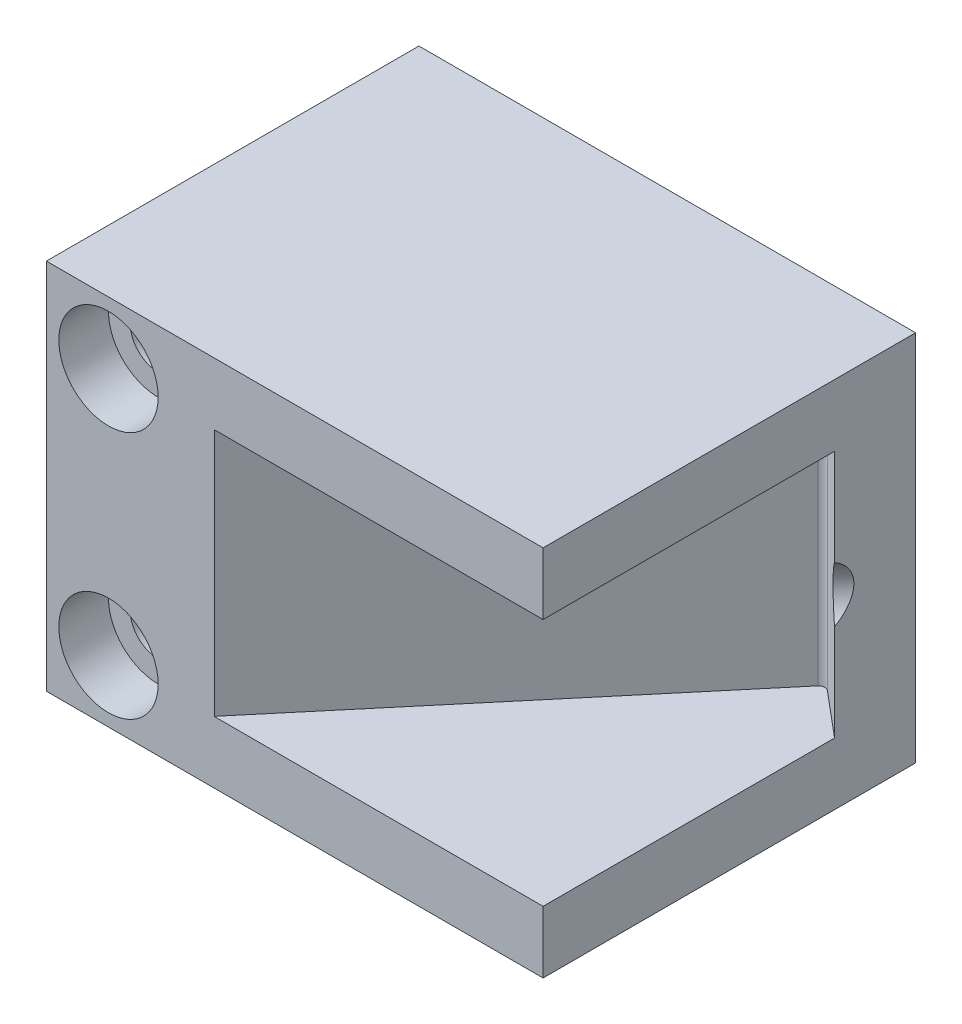
ISO-10303-21;
HEADER;
FILE_DESCRIPTION(('STEP AP214'),'2;1');
FILE_NAME('part.step','',(''),(''),'','','');
FILE_SCHEMA(('AUTOMOTIVE_DESIGN { 1 0 10303 214 1 1 1 1 }'));
ENDSEC;
DATA;
#1=APPLICATION_CONTEXT('core data for automotive mechanical design processes');
#2=APPLICATION_PROTOCOL_DEFINITION('international standard','automotive_design',2000,#1);
#3=PRODUCT_CONTEXT('',#1,'mechanical');
#4=PRODUCT('Part','Part','',(#3));
#5=PRODUCT_RELATED_PRODUCT_CATEGORY('part','',(#4));
#6=PRODUCT_DEFINITION_FORMATION('','',#4);
#7=PRODUCT_DEFINITION_CONTEXT('part definition',#1,'design');
#8=PRODUCT_DEFINITION('design','',#6,#7);
#9=PRODUCT_DEFINITION_SHAPE('','',#8);
#10=(LENGTH_UNIT() NAMED_UNIT(*) SI_UNIT(.MILLI.,.METRE.));
#11=(NAMED_UNIT(*) PLANE_ANGLE_UNIT() SI_UNIT($,.RADIAN.));
#12=(NAMED_UNIT(*) SI_UNIT($,.STERADIAN.) SOLID_ANGLE_UNIT());
#13=UNCERTAINTY_MEASURE_WITH_UNIT(LENGTH_MEASURE(1.E-05),#10,'distance_accuracy_value','');
#14=(GEOMETRIC_REPRESENTATION_CONTEXT(3) GLOBAL_UNCERTAINTY_ASSIGNED_CONTEXT((#13)) GLOBAL_UNIT_ASSIGNED_CONTEXT((#10,
#11,#12)) REPRESENTATION_CONTEXT('',''));
#15=CARTESIAN_POINT('',(0.,0.,0.));
#16=DIRECTION('',(0.,0.,1.));
#17=DIRECTION('',(1.,0.,0.));
#18=AXIS2_PLACEMENT_3D('',#15,#16,#17);
#19=CARTESIAN_POINT('',(20.,15.,15.));
#20=DIRECTION('',(-1.,0.,0.));
#21=DIRECTION('',(0.,-1.,0.));
#22=AXIS2_PLACEMENT_3D('',#19,#20,#21);
#23=PLANE('',#22);
#24=DIRECTION('',(0.,1.,0.));
#25=VECTOR('',#24,1.);
#26=CARTESIAN_POINT('',(20.,15.,-8.47296355333858));
#27=LINE('',#26,#25);
#28=CARTESIAN_POINT('',(20.,2.23606797749979,-8.47296355333857));
#29=VERTEX_POINT('',#28);
#30=CARTESIAN_POINT('',(20.,10.,-8.47296355333858));
#31=VERTEX_POINT('',#30);
#32=EDGE_CURVE('E124',#29,#31,#27,.T.);
#33=ORIENTED_EDGE('',*,*,#32,.F.);
#34=CARTESIAN_POINT('',(20.,0.,-5.36151589961776));
#35=DIRECTION('',(-1.,0.,0.));
#36=DIRECTION('',(0.,0.,1.));
#37=AXIS2_PLACEMENT_3D('',#34,#35,#36);
#38=ELLIPSE('',#37,4.66717148058121,3.);
#39=CARTESIAN_POINT('',(20.,-2.23606797749979,-8.47296355333858));
#40=VERTEX_POINT('',#39);
#41=EDGE_CURVE('E47',#29,#40,#38,.T.);
#42=ORIENTED_EDGE('',*,*,#41,.T.);
#43=CARTESIAN_POINT('',(20.,-9.99999999999999,-8.47296355333858));
#44=VERTEX_POINT('',#43);
#45=EDGE_CURVE('E122',#44,#40,#27,.T.);
#46=ORIENTED_EDGE('',*,*,#45,.F.);
#47=DIRECTION('',(0.,0.,-1.));
#48=VECTOR('',#47,1.);
#49=CARTESIAN_POINT('',(20.,-10.,15.));
#50=LINE('',#49,#48);
#51=CARTESIAN_POINT('',(20.,-10.,15.));
#52=VERTEX_POINT('',#51);
#53=EDGE_CURVE('E146',#52,#44,#50,.T.);
#54=ORIENTED_EDGE('',*,*,#53,.F.);
#55=DIRECTION('',(0.,1.,0.));
#56=VECTOR('',#55,1.);
#57=CARTESIAN_POINT('',(20.,15.,15.));
#58=LINE('',#57,#56);
#59=CARTESIAN_POINT('',(20.,-15.,15.));
#60=VERTEX_POINT('',#59);
#61=EDGE_CURVE('E172',#60,#52,#58,.T.);
#62=ORIENTED_EDGE('',*,*,#61,.F.);
#63=DIRECTION('',(0.,0.,-1.));
#64=VECTOR('',#63,1.);
#65=CARTESIAN_POINT('',(20.,-15.,15.));
#66=LINE('',#65,#64);
#67=CARTESIAN_POINT('',(20.,-15.,-15.));
#68=VERTEX_POINT('',#67);
#69=EDGE_CURVE('E182',#60,#68,#66,.T.);
#70=ORIENTED_EDGE('',*,*,#69,.T.);
#71=DIRECTION('',(0.,1.,0.));
#72=VECTOR('',#71,1.);
#73=CARTESIAN_POINT('',(20.,15.,-15.));
#74=LINE('',#73,#72);
#75=CARTESIAN_POINT('',(20.,15.,-15.));
#76=VERTEX_POINT('',#75);
#77=EDGE_CURVE('E171',#68,#76,#74,.T.);
#78=ORIENTED_EDGE('',*,*,#77,.T.);
#79=DIRECTION('',(0.,0.,-1.));
#80=VECTOR('',#79,1.);
#81=CARTESIAN_POINT('',(20.,15.,15.));
#82=LINE('',#81,#80);
#83=CARTESIAN_POINT('',(20.,15.,15.));
#84=VERTEX_POINT('',#83);
#85=EDGE_CURVE('E199',#84,#76,#82,.T.);
#86=ORIENTED_EDGE('',*,*,#85,.F.);
#87=CARTESIAN_POINT('',(20.,10.,15.));
#88=VERTEX_POINT('',#87);
#89=EDGE_CURVE('E176',#88,#84,#58,.T.);
#90=ORIENTED_EDGE('',*,*,#89,.F.);
#91=DIRECTION('',(0.,0.,1.));
#92=VECTOR('',#91,1.);
#93=CARTESIAN_POINT('',(20.,10.,15.));
#94=LINE('',#93,#92);
#95=EDGE_CURVE('E169',#31,#88,#94,.T.);
#96=ORIENTED_EDGE('',*,*,#95,.F.);
#97=EDGE_LOOP('',(#33,#42,#46,#54,#62,#70,#78,#86,#90,#96));
#98=FACE_BOUND('',#97,.T.);
#99=ADVANCED_FACE('F33',(#98),#23,.F.);
#100=CARTESIAN_POINT('',(0.,0.,15.));
#101=DIRECTION('',(0.,0.,1.));
#102=DIRECTION('',(1.,0.,0.));
#103=AXIS2_PLACEMENT_3D('',#100,#101,#102);
#104=PLANE('',#103);
#105=CARTESIAN_POINT('',(-15.,10.,15.));
#106=DIRECTION('',(0.,0.,1.));
#107=DIRECTION('',(1.,0.,0.));
#108=AXIS2_PLACEMENT_3D('',#105,#106,#107);
#109=CIRCLE('',#108,4.);
#110=CARTESIAN_POINT('',(-11.,10.,15.));
#111=VERTEX_POINT('',#110);
#112=EDGE_CURVE('E380',#111,#111,#109,.T.);
#113=ORIENTED_EDGE('',*,*,#112,.F.);
#114=EDGE_LOOP('',(#113));
#115=FACE_BOUND('',#114,.T.);
#116=CARTESIAN_POINT('',(-15.,-10.,15.));
#117=DIRECTION('',(0.,0.,1.));
#118=DIRECTION('',(1.,0.,0.));
#119=AXIS2_PLACEMENT_3D('',#116,#117,#118);
#120=CIRCLE('',#119,4.);
#121=CARTESIAN_POINT('',(-11.,-10.,15.));
#122=VERTEX_POINT('',#121);
#123=EDGE_CURVE('E390',#122,#122,#120,.T.);
#124=ORIENTED_EDGE('',*,*,#123,.F.);
#125=EDGE_LOOP('',(#124));
#126=FACE_BOUND('',#125,.T.);
#127=DIRECTION('',(0.,1.,0.));
#128=VECTOR('',#127,1.);
#129=CARTESIAN_POINT('',(-6.4763452965902,0.,15.));
#130=LINE('',#129,#128);
#131=CARTESIAN_POINT('',(-6.4763452965902,-10.,15.));
#132=VERTEX_POINT('',#131);
#133=CARTESIAN_POINT('',(-6.4763452965902,10.,15.));
#134=VERTEX_POINT('',#133);
#135=EDGE_CURVE('E204',#132,#134,#130,.T.);
#136=ORIENTED_EDGE('',*,*,#135,.T.);
#137=DIRECTION('',(1.,0.,0.));
#138=VECTOR('',#137,1.);
#139=CARTESIAN_POINT('',(0.,10.,15.));
#140=LINE('',#139,#138);
#141=EDGE_CURVE('E134',#134,#88,#140,.T.);
#142=ORIENTED_EDGE('',*,*,#141,.T.);
#143=ORIENTED_EDGE('',*,*,#89,.T.);
#144=DIRECTION('',(-1.,0.,0.));
#145=VECTOR('',#144,1.);
#146=CARTESIAN_POINT('',(-20.,15.,15.));
#147=LINE('',#146,#145);
#148=CARTESIAN_POINT('',(-20.,15.,15.));
#149=VERTEX_POINT('',#148);
#150=EDGE_CURVE('E175',#84,#149,#147,.T.);
#151=ORIENTED_EDGE('',*,*,#150,.T.);
#152=DIRECTION('',(0.,-1.,0.));
#153=VECTOR('',#152,1.);
#154=CARTESIAN_POINT('',(-20.,15.,15.));
#155=LINE('',#154,#153);
#156=CARTESIAN_POINT('',(-20.,-15.,15.));
#157=VERTEX_POINT('',#156);
#158=EDGE_CURVE('E178',#149,#157,#155,.T.);
#159=ORIENTED_EDGE('',*,*,#158,.T.);
#160=DIRECTION('',(1.,0.,0.));
#161=VECTOR('',#160,1.);
#162=CARTESIAN_POINT('',(-20.,-15.,15.));
#163=LINE('',#162,#161);
#164=EDGE_CURVE('E180',#157,#60,#163,.T.);
#165=ORIENTED_EDGE('',*,*,#164,.T.);
#166=ORIENTED_EDGE('',*,*,#61,.T.);
#167=DIRECTION('',(-1.,0.,0.));
#168=VECTOR('',#167,1.);
#169=CARTESIAN_POINT('',(0.,-10.,15.));
#170=LINE('',#169,#168);
#171=EDGE_CURVE('E202',#52,#132,#170,.T.);
#172=ORIENTED_EDGE('',*,*,#171,.T.);
#173=EDGE_LOOP('',(#136,#142,#143,#151,#159,#165,#166,#172));
#174=FACE_BOUND('',#173,.T.);
#175=ADVANCED_FACE('F210',(#115,#126,#174),#104,.T.);
#176=CARTESIAN_POINT('',(-20.,15.,15.));
#177=DIRECTION('',(0.,-1.,0.));
#178=DIRECTION('',(0.,0.,-1.));
#179=AXIS2_PLACEMENT_3D('',#176,#177,#178);
#180=PLANE('',#179);
#181=DIRECTION('',(-1.,0.,0.));
#182=VECTOR('',#181,1.);
#183=CARTESIAN_POINT('',(-20.,15.,-15.));
#184=LINE('',#183,#182);
#185=CARTESIAN_POINT('',(-20.,15.,-15.));
#186=VERTEX_POINT('',#185);
#187=EDGE_CURVE('E185',#76,#186,#184,.T.);
#188=ORIENTED_EDGE('',*,*,#187,.T.);
#189=DIRECTION('',(0.,0.,-1.));
#190=VECTOR('',#189,1.);
#191=CARTESIAN_POINT('',(-20.,15.,15.));
#192=LINE('',#191,#190);
#193=EDGE_CURVE('E196',#149,#186,#192,.T.);
#194=ORIENTED_EDGE('',*,*,#193,.F.);
#195=ORIENTED_EDGE('',*,*,#150,.F.);
#196=ORIENTED_EDGE('',*,*,#85,.T.);
#197=EDGE_LOOP('',(#188,#194,#195,#196));
#198=FACE_BOUND('',#197,.T.);
#199=ADVANCED_FACE('F216',(#198),#180,.F.);
#200=CARTESIAN_POINT('',(-20.,15.,15.));
#201=DIRECTION('',(1.,0.,0.));
#202=DIRECTION('',(0.,1.,0.));
#203=AXIS2_PLACEMENT_3D('',#200,#201,#202);
#204=PLANE('',#203);
#205=DIRECTION('',(0.,-1.,0.));
#206=VECTOR('',#205,1.);
#207=CARTESIAN_POINT('',(-20.,15.,-15.));
#208=LINE('',#207,#206);
#209=CARTESIAN_POINT('',(-20.,-15.,-15.));
#210=VERTEX_POINT('',#209);
#211=EDGE_CURVE('E187',#186,#210,#208,.T.);
#212=ORIENTED_EDGE('',*,*,#211,.T.);
#213=DIRECTION('',(0.,0.,-1.));
#214=VECTOR('',#213,1.);
#215=CARTESIAN_POINT('',(-20.,-15.,15.));
#216=LINE('',#215,#214);
#217=EDGE_CURVE('E193',#157,#210,#216,.T.);
#218=ORIENTED_EDGE('',*,*,#217,.F.);
#219=ORIENTED_EDGE('',*,*,#158,.F.);
#220=ORIENTED_EDGE('',*,*,#193,.T.);
#221=EDGE_LOOP('',(#212,#218,#219,#220));
#222=FACE_BOUND('',#221,.T.);
#223=ADVANCED_FACE('F223',(#222),#204,.F.);
#224=CARTESIAN_POINT('',(-20.,-15.,15.));
#225=DIRECTION('',(0.,1.,0.));
#226=DIRECTION('',(0.,0.,1.));
#227=AXIS2_PLACEMENT_3D('',#224,#225,#226);
#228=PLANE('',#227);
#229=DIRECTION('',(1.,0.,0.));
#230=VECTOR('',#229,1.);
#231=CARTESIAN_POINT('',(-20.,-15.,-15.));
#232=LINE('',#231,#230);
#233=EDGE_CURVE('E189',#210,#68,#232,.T.);
#234=ORIENTED_EDGE('',*,*,#233,.T.);
#235=ORIENTED_EDGE('',*,*,#69,.F.);
#236=ORIENTED_EDGE('',*,*,#164,.F.);
#237=ORIENTED_EDGE('',*,*,#217,.T.);
#238=EDGE_LOOP('',(#234,#235,#236,#237));
#239=FACE_BOUND('',#238,.T.);
#240=ADVANCED_FACE('F227',(#239),#228,.F.);
#241=CARTESIAN_POINT('',(0.,0.,-15.));
#242=DIRECTION('',(0.,0.,1.));
#243=DIRECTION('',(1.,0.,0.));
#244=AXIS2_PLACEMENT_3D('',#241,#242,#243);
#245=PLANE('',#244);
#246=CARTESIAN_POINT('',(-15.,10.,-15.));
#247=DIRECTION('',(0.,0.,1.));
#248=DIRECTION('',(1.,0.,0.));
#249=AXIS2_PLACEMENT_3D('',#246,#247,#248);
#250=CIRCLE('',#249,2.24999999999999);
#251=CARTESIAN_POINT('',(-12.75,10.,-15.));
#252=VERTEX_POINT('',#251);
#253=EDGE_CURVE('E387',#252,#252,#250,.T.);
#254=ORIENTED_EDGE('',*,*,#253,.T.);
#255=EDGE_LOOP('',(#254));
#256=FACE_BOUND('',#255,.T.);
#257=CARTESIAN_POINT('',(-15.,-10.,-15.));
#258=DIRECTION('',(0.,0.,1.));
#259=DIRECTION('',(1.,0.,0.));
#260=AXIS2_PLACEMENT_3D('',#257,#258,#259);
#261=CIRCLE('',#260,2.24999999999999);
#262=CARTESIAN_POINT('',(-12.75,-10.,-15.));
#263=VERTEX_POINT('',#262);
#264=EDGE_CURVE('E117',#263,#263,#261,.T.);
#265=ORIENTED_EDGE('',*,*,#264,.T.);
#266=EDGE_LOOP('',(#265));
#267=FACE_BOUND('',#266,.T.);
#268=ORIENTED_EDGE('',*,*,#77,.F.);
#269=ORIENTED_EDGE('',*,*,#233,.F.);
#270=ORIENTED_EDGE('',*,*,#211,.F.);
#271=ORIENTED_EDGE('',*,*,#187,.F.);
#272=EDGE_LOOP('',(#268,#269,#270,#271));
#273=FACE_BOUND('',#272,.T.);
#274=ADVANCED_FACE('F253',(#256,#267,#273),#245,.F.);
#275=CARTESIAN_POINT('',(31.5581782467504,10.,1.22549955059109));
#276=DIRECTION('',(-0.642787609686544,0.,0.766044443118974));
#277=DIRECTION('',(0.766044443118974,0.,0.642787609686544));
#278=AXIS2_PLACEMENT_3D('',#275,#276,#277);
#279=PLANE('',#278);
#280=CARTESIAN_POINT('',(21.532088886238,0.,-7.18738833396549));
#281=DIRECTION('',(-0.642787609686544,0.,0.766044443118975));
#282=DIRECTION('',(-0.766044443118975,0.,-0.642787609686544));
#283=AXIS2_PLACEMENT_3D('',#280,#281,#282);
#284=CIRCLE('',#283,3.);
#285=EDGE_CURVE('E113',#29,#40,#284,.T.);
#286=ORIENTED_EDGE('',*,*,#285,.F.);
#287=ORIENTED_EDGE('',*,*,#32,.T.);
#288=DIRECTION('',(-0.766044443118974,0.,-0.642787609686544));
#289=VECTOR('',#288,1.);
#290=CARTESIAN_POINT('',(31.5581782467504,10.,1.22549955059109));
#291=LINE('',#290,#289);
#292=CARTESIAN_POINT('',(16.3934196596386,10.,-11.4992437867471));
#293=VERTEX_POINT('',#292);
#294=EDGE_CURVE('E142',#31,#293,#291,.T.);
#295=ORIENTED_EDGE('',*,*,#294,.T.);
#296=DIRECTION('',(0.,1.,0.));
#297=VECTOR('',#296,1.);
#298=CARTESIAN_POINT('',(16.3934196596386,-9.99999999999999,-11.4992437867471));
#299=LINE('',#298,#297);
#300=CARTESIAN_POINT('',(16.3934196596386,-9.99999999999999,-11.4992437867471));
#301=VERTEX_POINT('',#300);
#302=EDGE_CURVE('E41',#293,#301,#299,.F.);
#303=ORIENTED_EDGE('',*,*,#302,.T.);
#304=DIRECTION('',(-0.766044443118974,0.,-0.642787609686544));
#305=VECTOR('',#304,1.);
#306=CARTESIAN_POINT('',(31.5581782467504,-9.99999999999999,1.22549955059109));
#307=LINE('',#306,#305);
#308=EDGE_CURVE('E128',#44,#301,#307,.T.);
#309=ORIENTED_EDGE('',*,*,#308,.F.);
#310=ORIENTED_EDGE('',*,*,#45,.T.);
#311=EDGE_LOOP('',(#286,#287,#295,#303,#309,#310));
#312=FACE_BOUND('',#311,.T.);
#313=ADVANCED_FACE('F127',(#312),#279,.T.);
#314=CARTESIAN_POINT('',(9.0606119077214,10.,28.0370550597552));
#315=DIRECTION('',(0.,-1.,0.));
#316=DIRECTION('',(0.,0.,-1.));
#317=AXIS2_PLACEMENT_3D('',#314,#315,#316);
#318=PLANE('',#317);
#319=DIRECTION('',(-0.642787609686544,0.,0.766044443118974));
#320=VECTOR('',#319,1.);
#321=CARTESIAN_POINT('',(-6.48716890094992,10.,14.9909179175737));
#322=LINE('',#321,#320);
#323=CARTESIAN_POINT('',(15.6890036332358,10.,-11.4376153700309));
#324=VERTEX_POINT('',#323);
#325=CARTESIAN_POINT('',(-6.48716890094992,10.,14.9909179175737));
#326=VERTEX_POINT('',#325);
#327=EDGE_CURVE('E125',#324,#326,#322,.T.);
#328=ORIENTED_EDGE('',*,*,#327,.F.);
#329=CARTESIAN_POINT('',(16.0720258547953,10.,-11.1162215651876));
#330=DIRECTION('',(0.,-1.,0.));
#331=DIRECTION('',(0.,0.,-1.));
#332=AXIS2_PLACEMENT_3D('',#329,#330,#331);
#333=CIRCLE('',#332,0.5);
#334=EDGE_CURVE('E132',#324,#293,#333,.T.);
#335=ORIENTED_EDGE('',*,*,#334,.T.);
#336=ORIENTED_EDGE('',*,*,#294,.F.);
#337=ORIENTED_EDGE('',*,*,#95,.T.);
#338=ORIENTED_EDGE('',*,*,#141,.F.);
#339=DIRECTION('',(-0.766044443118974,0.,-0.642787609686544));
#340=VECTOR('',#339,1.);
#341=CARTESIAN_POINT('',(9.0606119077214,10.,28.0370550597552));
#342=LINE('',#341,#340);
#343=EDGE_CURVE('E147',#134,#326,#342,.T.);
#344=ORIENTED_EDGE('',*,*,#343,.T.);
#345=EDGE_LOOP('',(#328,#335,#336,#337,#338,#344));
#346=FACE_BOUND('',#345,.T.);
#347=ADVANCED_FACE('F141',(#346),#318,.T.);
#348=CARTESIAN_POINT('',(9.0606119077214,-10.,28.0370550597552));
#349=DIRECTION('',(0.,1.,0.));
#350=DIRECTION('',(0.,0.,1.));
#351=AXIS2_PLACEMENT_3D('',#348,#349,#350);
#352=PLANE('',#351);
#353=ORIENTED_EDGE('',*,*,#308,.T.);
#354=CARTESIAN_POINT('',(16.0720258547953,-9.99999999999999,-11.1162215651876));
#355=DIRECTION('',(0.,1.,0.));
#356=DIRECTION('',(0.,0.,1.));
#357=AXIS2_PLACEMENT_3D('',#354,#355,#356);
#358=CIRCLE('',#357,0.5);
#359=CARTESIAN_POINT('',(15.6890036332358,-9.99999999999999,-11.4376153700309));
#360=VERTEX_POINT('',#359);
#361=EDGE_CURVE('E11',#301,#360,#358,.T.);
#362=ORIENTED_EDGE('',*,*,#361,.T.);
#363=DIRECTION('',(0.642787609686544,0.,-0.766044443118974));
#364=VECTOR('',#363,1.);
#365=CARTESIAN_POINT('',(-6.48716890094992,-10.,14.9909179175737));
#366=LINE('',#365,#364);
#367=CARTESIAN_POINT('',(-6.48716890094992,-10.,14.9909179175737));
#368=VERTEX_POINT('',#367);
#369=EDGE_CURVE('E154',#368,#360,#366,.T.);
#370=ORIENTED_EDGE('',*,*,#369,.F.);
#371=DIRECTION('',(-0.766044443118974,0.,-0.642787609686544));
#372=VECTOR('',#371,1.);
#373=CARTESIAN_POINT('',(9.0606119077214,-10.,28.0370550597552));
#374=LINE('',#373,#372);
#375=EDGE_CURVE('E161',#132,#368,#374,.T.);
#376=ORIENTED_EDGE('',*,*,#375,.F.);
#377=ORIENTED_EDGE('',*,*,#171,.F.);
#378=ORIENTED_EDGE('',*,*,#53,.T.);
#379=EDGE_LOOP('',(#353,#362,#370,#376,#377,#378));
#380=FACE_BOUND('',#379,.T.);
#381=ADVANCED_FACE('F153',(#380),#352,.T.);
#382=CARTESIAN_POINT('',(9.0606119077214,10.,28.0370550597552));
#383=DIRECTION('',(0.642787609686544,0.,-0.766044443118974));
#384=DIRECTION('',(-0.766044443118974,0.,-0.642787609686544));
#385=AXIS2_PLACEMENT_3D('',#382,#383,#384);
#386=PLANE('',#385);
#387=ORIENTED_EDGE('',*,*,#375,.T.);
#388=DIRECTION('',(0.,-1.,0.));
#389=VECTOR('',#388,1.);
#390=CARTESIAN_POINT('',(-6.48716890094992,10.,14.9909179175737));
#391=LINE('',#390,#389);
#392=EDGE_CURVE('E159',#326,#368,#391,.T.);
#393=ORIENTED_EDGE('',*,*,#392,.F.);
#394=ORIENTED_EDGE('',*,*,#343,.F.);
#395=ORIENTED_EDGE('',*,*,#135,.F.);
#396=EDGE_LOOP('',(#387,#393,#394,#395));
#397=FACE_BOUND('',#396,.T.);
#398=ADVANCED_FACE('F230',(#397),#386,.T.);
#399=CARTESIAN_POINT('',(3.57475911558945,0.,2.99957905543876));
#400=DIRECTION('',(0.766044443118974,0.,0.642787609686544));
#401=DIRECTION('',(0.642787609686544,0.,-0.766044443118974));
#402=AXIS2_PLACEMENT_3D('',#399,#400,#401);
#403=PLANE('',#402);
#404=ORIENTED_EDGE('',*,*,#369,.T.);
#405=DIRECTION('',(0.,1.,0.));
#406=VECTOR('',#405,1.);
#407=CARTESIAN_POINT('',(15.6890036332358,10.,-11.4376153700309));
#408=LINE('',#407,#406);
#409=EDGE_CURVE('E129',#360,#324,#408,.T.);
#410=ORIENTED_EDGE('',*,*,#409,.T.);
#411=ORIENTED_EDGE('',*,*,#327,.T.);
#412=ORIENTED_EDGE('',*,*,#392,.T.);
#413=EDGE_LOOP('',(#404,#410,#411,#412));
#414=FACE_BOUND('',#413,.T.);
#415=ADVANCED_FACE('F157',(#414),#403,.T.);
#416=CARTESIAN_POINT('',(16.0720258547953,0.,-11.1162215651876));
#417=DIRECTION('',(0.,-1.,0.));
#418=DIRECTION('',(0.,0.,-1.));
#419=AXIS2_PLACEMENT_3D('',#416,#417,#418);
#420=CYLINDRICAL_SURFACE('',#419,0.5);
#421=ORIENTED_EDGE('',*,*,#361,.F.);
#422=ORIENTED_EDGE('',*,*,#302,.F.);
#423=ORIENTED_EDGE('',*,*,#334,.F.);
#424=ORIENTED_EDGE('',*,*,#409,.F.);
#425=EDGE_LOOP('',(#421,#422,#423,#424));
#426=FACE_BOUND('',#425,.T.);
#427=ADVANCED_FACE('F35',(#426),#420,.F.);
#428=CARTESIAN_POINT('',(24.1032393249841,0.,-10.2515661064414));
#429=DIRECTION('',(-0.642787609686544,0.,0.766044443118975));
#430=DIRECTION('',(0.766044443118975,0.,0.642787609686544));
#431=AXIS2_PLACEMENT_3D('',#428,#429,#430);
#432=CYLINDRICAL_SURFACE('',#431,3.);
#433=ORIENTED_EDGE('',*,*,#285,.T.);
#434=ORIENTED_EDGE('',*,*,#41,.F.);
#435=EDGE_LOOP('',(#433,#434));
#436=FACE_BOUND('',#435,.T.);
#437=ADVANCED_FACE('F114',(#436),#432,.F.);
#438=CARTESIAN_POINT('',(-15.,-10.,15.));
#439=DIRECTION('',(0.,0.,1.));
#440=DIRECTION('',(1.,0.,0.));
#441=AXIS2_PLACEMENT_3D('',#438,#439,#440);
#442=CYLINDRICAL_SURFACE('',#441,2.25);
#443=ORIENTED_EDGE('',*,*,#264,.F.);
#444=EDGE_LOOP('',(#443));
#445=FACE_BOUND('',#444,.T.);
#446=CARTESIAN_POINT('',(-15.,-10.,11.));
#447=DIRECTION('',(0.,0.,1.));
#448=DIRECTION('',(1.,0.,0.));
#449=AXIS2_PLACEMENT_3D('',#446,#447,#448);
#450=CIRCLE('',#449,2.25);
#451=CARTESIAN_POINT('',(-12.75,-10.,11.));
#452=VERTEX_POINT('',#451);
#453=EDGE_CURVE('E396',#452,#452,#450,.T.);
#454=ORIENTED_EDGE('',*,*,#453,.T.);
#455=EDGE_LOOP('',(#454));
#456=FACE_BOUND('',#455,.T.);
#457=ADVANCED_FACE('F299',(#445,#456),#442,.F.);
#458=CARTESIAN_POINT('',(-12.75,-10.,11.));
#459=DIRECTION('',(0.,0.,-1.));
#460=DIRECTION('',(-1.,0.,0.));
#461=AXIS2_PLACEMENT_3D('',#458,#459,#460);
#462=PLANE('',#461);
#463=ORIENTED_EDGE('',*,*,#453,.F.);
#464=EDGE_LOOP('',(#463));
#465=FACE_BOUND('',#464,.T.);
#466=CARTESIAN_POINT('',(-15.,-10.,11.));
#467=DIRECTION('',(0.,0.,1.));
#468=DIRECTION('',(1.,0.,0.));
#469=AXIS2_PLACEMENT_3D('',#466,#467,#468);
#470=CIRCLE('',#469,4.);
#471=CARTESIAN_POINT('',(-11.,-10.,11.));
#472=VERTEX_POINT('',#471);
#473=EDGE_CURVE('E393',#472,#472,#470,.T.);
#474=ORIENTED_EDGE('',*,*,#473,.T.);
#475=EDGE_LOOP('',(#474));
#476=FACE_BOUND('',#475,.T.);
#477=ADVANCED_FACE('F320',(#465,#476),#462,.F.);
#478=CARTESIAN_POINT('',(-15.,-10.,15.));
#479=DIRECTION('',(0.,0.,1.));
#480=DIRECTION('',(1.,0.,0.));
#481=AXIS2_PLACEMENT_3D('',#478,#479,#480);
#482=CYLINDRICAL_SURFACE('',#481,4.);
#483=ORIENTED_EDGE('',*,*,#473,.F.);
#484=EDGE_LOOP('',(#483));
#485=FACE_BOUND('',#484,.T.);
#486=ORIENTED_EDGE('',*,*,#123,.T.);
#487=EDGE_LOOP('',(#486));
#488=FACE_BOUND('',#487,.T.);
#489=ADVANCED_FACE('F330',(#485,#488),#482,.F.);
#490=CARTESIAN_POINT('',(-15.,10.,15.));
#491=DIRECTION('',(0.,0.,1.));
#492=DIRECTION('',(1.,0.,0.));
#493=AXIS2_PLACEMENT_3D('',#490,#491,#492);
#494=CYLINDRICAL_SURFACE('',#493,2.25);
#495=ORIENTED_EDGE('',*,*,#253,.F.);
#496=EDGE_LOOP('',(#495));
#497=FACE_BOUND('',#496,.T.);
#498=CARTESIAN_POINT('',(-15.,10.,11.));
#499=DIRECTION('',(0.,0.,1.));
#500=DIRECTION('',(1.,0.,0.));
#501=AXIS2_PLACEMENT_3D('',#498,#499,#500);
#502=CIRCLE('',#501,2.25);
#503=CARTESIAN_POINT('',(-12.75,10.,11.));
#504=VERTEX_POINT('',#503);
#505=EDGE_CURVE('E382',#504,#504,#502,.T.);
#506=ORIENTED_EDGE('',*,*,#505,.T.);
#507=EDGE_LOOP('',(#506));
#508=FACE_BOUND('',#507,.T.);
#509=ADVANCED_FACE('F340',(#497,#508),#494,.F.);
#510=CARTESIAN_POINT('',(-12.75,10.,11.));
#511=DIRECTION('',(0.,0.,-1.));
#512=DIRECTION('',(-1.,0.,0.));
#513=AXIS2_PLACEMENT_3D('',#510,#511,#512);
#514=PLANE('',#513);
#515=ORIENTED_EDGE('',*,*,#505,.F.);
#516=EDGE_LOOP('',(#515));
#517=FACE_BOUND('',#516,.T.);
#518=CARTESIAN_POINT('',(-15.,10.,11.));
#519=DIRECTION('',(0.,0.,1.));
#520=DIRECTION('',(1.,0.,0.));
#521=AXIS2_PLACEMENT_3D('',#518,#519,#520);
#522=CIRCLE('',#521,4.);
#523=CARTESIAN_POINT('',(-11.,10.,11.));
#524=VERTEX_POINT('',#523);
#525=EDGE_CURVE('E377',#524,#524,#522,.T.);
#526=ORIENTED_EDGE('',*,*,#525,.T.);
#527=EDGE_LOOP('',(#526));
#528=FACE_BOUND('',#527,.T.);
#529=ADVANCED_FACE('F350',(#517,#528),#514,.F.);
#530=CARTESIAN_POINT('',(-15.,10.,15.));
#531=DIRECTION('',(0.,0.,1.));
#532=DIRECTION('',(1.,0.,0.));
#533=AXIS2_PLACEMENT_3D('',#530,#531,#532);
#534=CYLINDRICAL_SURFACE('',#533,4.);
#535=ORIENTED_EDGE('',*,*,#525,.F.);
#536=EDGE_LOOP('',(#535));
#537=FACE_BOUND('',#536,.T.);
#538=ORIENTED_EDGE('',*,*,#112,.T.);
#539=EDGE_LOOP('',(#538));
#540=FACE_BOUND('',#539,.T.);
#541=ADVANCED_FACE('F360',(#537,#540),#534,.F.);
#542=CLOSED_SHELL('',(#99,#175,#199,#223,#240,#274,#313,#347,#381,#398,#415,#427,#437,#457,#477,
#489,#509,#529,#541));
#543=MANIFOLD_SOLID_BREP('B2',#542);
#544=ADVANCED_BREP_SHAPE_REPRESENTATION('',(#18,#543),#14);
#545=SHAPE_DEFINITION_REPRESENTATION(#9,#544);
ENDSEC;
END-ISO-10303-21;
